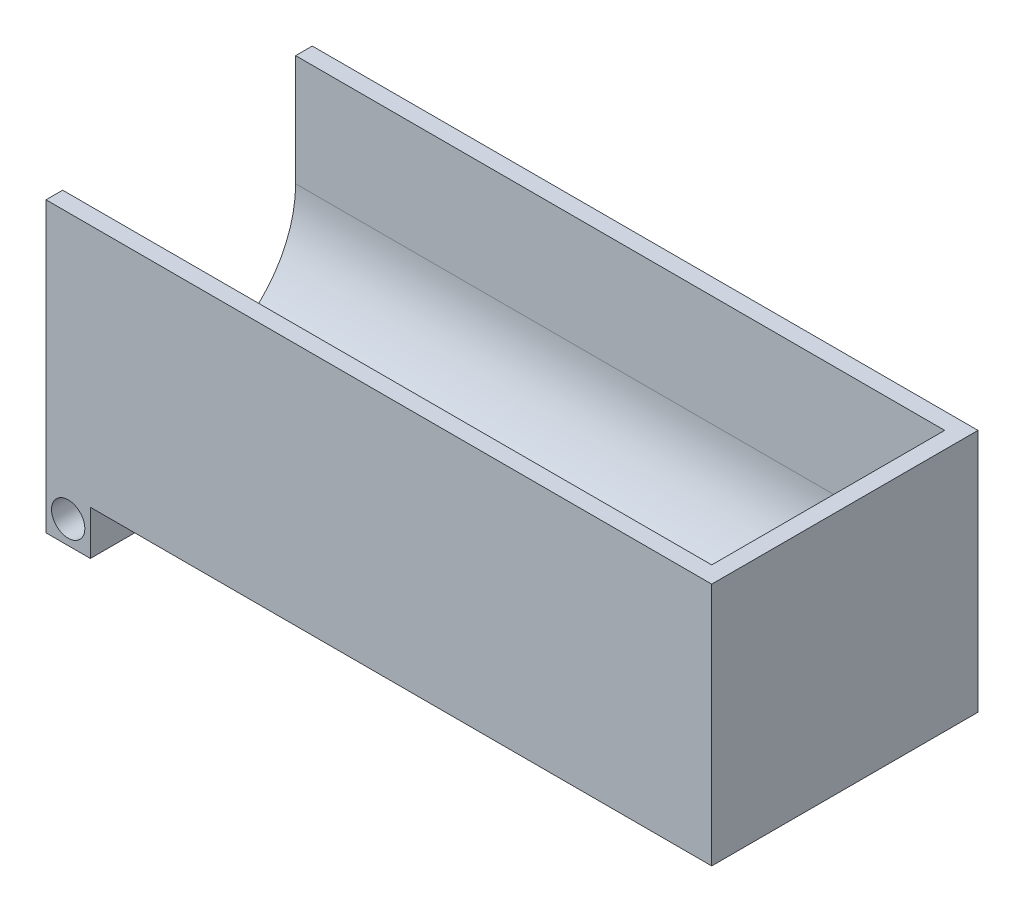
ISO-10303-21;
HEADER;
FILE_DESCRIPTION(('STEP AP214'),'2;1');
FILE_NAME('part.step','',(''),(''),'','','');
FILE_SCHEMA(('AUTOMOTIVE_DESIGN { 1 0 10303 214 1 1 1 1 }'));
ENDSEC;
DATA;
#1=APPLICATION_CONTEXT('core data for automotive mechanical design processes');
#2=APPLICATION_PROTOCOL_DEFINITION('international standard','automotive_design',2000,#1);
#3=PRODUCT_CONTEXT('',#1,'mechanical');
#4=PRODUCT('Part','Part','',(#3));
#5=PRODUCT_RELATED_PRODUCT_CATEGORY('part','',(#4));
#6=PRODUCT_DEFINITION_FORMATION('','',#4);
#7=PRODUCT_DEFINITION_CONTEXT('part definition',#1,'design');
#8=PRODUCT_DEFINITION('design','',#6,#7);
#9=PRODUCT_DEFINITION_SHAPE('','',#8);
#10=(LENGTH_UNIT() NAMED_UNIT(*) SI_UNIT(.MILLI.,.METRE.));
#11=(NAMED_UNIT(*) PLANE_ANGLE_UNIT() SI_UNIT($,.RADIAN.));
#12=(NAMED_UNIT(*) SI_UNIT($,.STERADIAN.) SOLID_ANGLE_UNIT());
#13=UNCERTAINTY_MEASURE_WITH_UNIT(LENGTH_MEASURE(1.E-05),#10,'distance_accuracy_value','');
#14=(GEOMETRIC_REPRESENTATION_CONTEXT(3) GLOBAL_UNCERTAINTY_ASSIGNED_CONTEXT((#13)) GLOBAL_UNIT_ASSIGNED_CONTEXT((#10,
#11,#12)) REPRESENTATION_CONTEXT('',''));
#15=CARTESIAN_POINT('',(0.,0.,0.));
#16=DIRECTION('',(0.,0.,1.));
#17=DIRECTION('',(1.,0.,0.));
#18=AXIS2_PLACEMENT_3D('',#15,#16,#17);
#19=CARTESIAN_POINT('',(120.,-24.,-24.));
#20=DIRECTION('',(0.,1.,0.));
#21=DIRECTION('',(0.,0.,1.));
#22=AXIS2_PLACEMENT_3D('',#19,#20,#21);
#23=PLANE('',#22);
#24=DIRECTION('',(-1.,0.,0.));
#25=VECTOR('',#24,1.);
#26=CARTESIAN_POINT('',(120.,-24.,24.));
#27=LINE('',#26,#25);
#28=CARTESIAN_POINT('',(120.,-24.,24.));
#29=VERTEX_POINT('',#28);
#30=CARTESIAN_POINT('',(8.,-24.,24.));
#31=VERTEX_POINT('',#30);
#32=EDGE_CURVE('E259',#29,#31,#27,.T.);
#33=ORIENTED_EDGE('',*,*,#32,.T.);
#34=DIRECTION('',(0.,0.,1.));
#35=VECTOR('',#34,1.);
#36=CARTESIAN_POINT('',(8.,-24.,-24.));
#37=LINE('',#36,#35);
#38=CARTESIAN_POINT('',(8.00000000000001,-24.,-24.));
#39=VERTEX_POINT('',#38);
#40=EDGE_CURVE('E239',#39,#31,#37,.T.);
#41=ORIENTED_EDGE('',*,*,#40,.F.);
#42=DIRECTION('',(-1.,0.,0.));
#43=VECTOR('',#42,1.);
#44=CARTESIAN_POINT('',(120.,-24.,-24.));
#45=LINE('',#44,#43);
#46=CARTESIAN_POINT('',(120.,-24.,-24.));
#47=VERTEX_POINT('',#46);
#48=EDGE_CURVE('E260',#47,#39,#45,.T.);
#49=ORIENTED_EDGE('',*,*,#48,.F.);
#50=DIRECTION('',(0.,0.,-1.));
#51=VECTOR('',#50,1.);
#52=CARTESIAN_POINT('',(120.,-24.,-24.));
#53=LINE('',#52,#51);
#54=EDGE_CURVE('E145',#29,#47,#53,.T.);
#55=ORIENTED_EDGE('',*,*,#54,.F.);
#56=EDGE_LOOP('',(#33,#41,#49,#55));
#57=FACE_BOUND('',#56,.T.);
#58=DIRECTION('',(0.,0.,-1.));
#59=VECTOR('',#58,1.);
#60=CARTESIAN_POINT('',(15.3705411386511,-24.,-13.3));
#61=LINE('',#60,#59);
#62=CARTESIAN_POINT('',(15.3705411386511,-24.,-10.3));
#63=VERTEX_POINT('',#62);
#64=CARTESIAN_POINT('',(15.3705411386511,-24.,-13.3));
#65=VERTEX_POINT('',#64);
#66=EDGE_CURVE('E195',#63,#65,#61,.T.);
#67=ORIENTED_EDGE('',*,*,#66,.F.);
#68=DIRECTION('',(-1.,0.,0.));
#69=VECTOR('',#68,1.);
#70=CARTESIAN_POINT('',(15.3705411386511,-24.,-10.3));
#71=LINE('',#70,#69);
#72=CARTESIAN_POINT('',(19.6916194956884,-24.,-10.3));
#73=VERTEX_POINT('',#72);
#74=EDGE_CURVE('E197',#73,#63,#71,.T.);
#75=ORIENTED_EDGE('',*,*,#74,.F.);
#76=DIRECTION('',(0.,0.,1.));
#77=VECTOR('',#76,1.);
#78=CARTESIAN_POINT('',(19.6916194956884,-24.,-13.3));
#79=LINE('',#78,#77);
#80=CARTESIAN_POINT('',(19.6916194956884,-24.,-13.3));
#81=VERTEX_POINT('',#80);
#82=EDGE_CURVE('E56',#81,#73,#79,.T.);
#83=ORIENTED_EDGE('',*,*,#82,.F.);
#84=DIRECTION('',(1.,0.,0.));
#85=VECTOR('',#84,1.);
#86=CARTESIAN_POINT('',(15.3705411386511,-24.,-13.3));
#87=LINE('',#86,#85);
#88=EDGE_CURVE('E53',#65,#81,#87,.T.);
#89=ORIENTED_EDGE('',*,*,#88,.F.);
#90=EDGE_LOOP('',(#67,#75,#83,#89));
#91=FACE_BOUND('',#90,.T.);
#92=ADVANCED_FACE('F39',(#57,#91),#23,.F.);
#93=CARTESIAN_POINT('',(120.,0.,0.));
#94=DIRECTION('',(-1.,0.,0.));
#95=DIRECTION('',(0.,0.,1.));
#96=AXIS2_PLACEMENT_3D('',#93,#94,#95);
#97=CYLINDRICAL_SURFACE('',#96,21.);
#98=DIRECTION('',(-1.,0.,0.));
#99=VECTOR('',#98,1.);
#100=CARTESIAN_POINT('',(120.,0.,21.));
#101=LINE('',#100,#99);
#102=CARTESIAN_POINT('',(117.,0.,21.));
#103=VERTEX_POINT('',#102);
#104=CARTESIAN_POINT('',(0.,0.,21.));
#105=VERTEX_POINT('',#104);
#106=EDGE_CURVE('E50',#103,#105,#101,.T.);
#107=ORIENTED_EDGE('',*,*,#106,.F.);
#108=CARTESIAN_POINT('',(117.,0.,0.));
#109=DIRECTION('',(-1.,0.,0.));
#110=DIRECTION('',(0.,0.,1.));
#111=AXIS2_PLACEMENT_3D('',#108,#109,#110);
#112=CIRCLE('',#111,21.);
#113=CARTESIAN_POINT('',(117.,0.,-21.));
#114=VERTEX_POINT('',#113);
#115=EDGE_CURVE('E11',#103,#114,#112,.F.);
#116=ORIENTED_EDGE('',*,*,#115,.T.);
#117=DIRECTION('',(-1.,0.,0.));
#118=VECTOR('',#117,1.);
#119=CARTESIAN_POINT('',(120.,0.,-21.));
#120=LINE('',#119,#118);
#121=CARTESIAN_POINT('',(0.,0.,-21.));
#122=VERTEX_POINT('',#121);
#123=EDGE_CURVE('E150',#114,#122,#120,.T.);
#124=ORIENTED_EDGE('',*,*,#123,.T.);
#125=CARTESIAN_POINT('',(0.,0.,0.));
#126=DIRECTION('',(-1.,0.,0.));
#127=DIRECTION('',(0.,0.,1.));
#128=AXIS2_PLACEMENT_3D('',#125,#126,#127);
#129=CIRCLE('',#128,21.);
#130=EDGE_CURVE('E245',#122,#105,#129,.T.);
#131=ORIENTED_EDGE('',*,*,#130,.T.);
#132=EDGE_LOOP('',(#107,#116,#124,#131));
#133=FACE_BOUND('',#132,.T.);
#134=ADVANCED_FACE('F41',(#133),#97,.F.);
#135=CARTESIAN_POINT('',(120.,-24.,24.));
#136=DIRECTION('',(0.,0.,-1.));
#137=DIRECTION('',(0.,1.,0.));
#138=AXIS2_PLACEMENT_3D('',#135,#136,#137);
#139=PLANE('',#138);
#140=DIRECTION('',(0.,-1.,0.));
#141=VECTOR('',#140,1.);
#142=CARTESIAN_POINT('',(120.,-24.,24.));
#143=LINE('',#142,#141);
#144=CARTESIAN_POINT('',(120.,20.,24.));
#145=VERTEX_POINT('',#144);
#146=EDGE_CURVE('E250',#145,#29,#143,.T.);
#147=ORIENTED_EDGE('',*,*,#146,.F.);
#148=DIRECTION('',(1.,0.,0.));
#149=VECTOR('',#148,1.);
#150=CARTESIAN_POINT('',(0.,20.,24.));
#151=LINE('',#150,#149);
#152=CARTESIAN_POINT('',(0.,20.,24.));
#153=VERTEX_POINT('',#152);
#154=EDGE_CURVE('E162',#153,#145,#151,.T.);
#155=ORIENTED_EDGE('',*,*,#154,.F.);
#156=DIRECTION('',(0.,-1.,0.));
#157=VECTOR('',#156,1.);
#158=CARTESIAN_POINT('',(0.,-24.,24.));
#159=LINE('',#158,#157);
#160=CARTESIAN_POINT('',(0.,-32.,24.));
#161=VERTEX_POINT('',#160);
#162=EDGE_CURVE('E252',#153,#161,#159,.T.);
#163=ORIENTED_EDGE('',*,*,#162,.T.);
#164=DIRECTION('',(1.,0.,0.));
#165=VECTOR('',#164,1.);
#166=CARTESIAN_POINT('',(0.,-32.,24.));
#167=LINE('',#166,#165);
#168=CARTESIAN_POINT('',(8.,-32.,24.));
#169=VERTEX_POINT('',#168);
#170=EDGE_CURVE('E226',#161,#169,#167,.T.);
#171=ORIENTED_EDGE('',*,*,#170,.T.);
#172=DIRECTION('',(0.,1.,0.));
#173=VECTOR('',#172,1.);
#174=CARTESIAN_POINT('',(8.,-24.,24.));
#175=LINE('',#174,#173);
#176=EDGE_CURVE('E233',#169,#31,#175,.T.);
#177=ORIENTED_EDGE('',*,*,#176,.T.);
#178=ORIENTED_EDGE('',*,*,#32,.F.);
#179=EDGE_LOOP('',(#147,#155,#163,#171,#177,#178));
#180=FACE_BOUND('',#179,.T.);
#181=CARTESIAN_POINT('',(4.,-27.8358408085531,24.));
#182=DIRECTION('',(0.,0.,1.));
#183=DIRECTION('',(1.,0.,0.));
#184=AXIS2_PLACEMENT_3D('',#181,#182,#183);
#185=CIRCLE('',#184,3.);
#186=CARTESIAN_POINT('',(7.,-27.8358408085531,24.));
#187=VERTEX_POINT('',#186);
#188=EDGE_CURVE('E219',#187,#187,#185,.T.);
#189=ORIENTED_EDGE('',*,*,#188,.F.);
#190=EDGE_LOOP('',(#189));
#191=FACE_BOUND('',#190,.T.);
#192=ADVANCED_FACE('F292',(#180,#191),#139,.F.);
#193=CARTESIAN_POINT('',(120.,0.,-24.));
#194=DIRECTION('',(0.,0.,1.));
#195=DIRECTION('',(0.,-1.,0.));
#196=AXIS2_PLACEMENT_3D('',#193,#194,#195);
#197=PLANE('',#196);
#198=ORIENTED_EDGE('',*,*,#48,.T.);
#199=DIRECTION('',(0.,1.,0.));
#200=VECTOR('',#199,1.);
#201=CARTESIAN_POINT('',(8.,-24.,-24.));
#202=LINE('',#201,#200);
#203=CARTESIAN_POINT('',(8.,-32.,-24.));
#204=VERTEX_POINT('',#203);
#205=EDGE_CURVE('E229',#204,#39,#202,.T.);
#206=ORIENTED_EDGE('',*,*,#205,.F.);
#207=DIRECTION('',(1.,0.,0.));
#208=VECTOR('',#207,1.);
#209=CARTESIAN_POINT('',(0.,-32.,-24.));
#210=LINE('',#209,#208);
#211=CARTESIAN_POINT('',(0.,-32.,-24.));
#212=VERTEX_POINT('',#211);
#213=EDGE_CURVE('E230',#212,#204,#210,.T.);
#214=ORIENTED_EDGE('',*,*,#213,.F.);
#215=DIRECTION('',(0.,1.,0.));
#216=VECTOR('',#215,1.);
#217=CARTESIAN_POINT('',(0.,0.,-24.));
#218=LINE('',#217,#216);
#219=CARTESIAN_POINT('',(0.,20.,-24.));
#220=VERTEX_POINT('',#219);
#221=EDGE_CURVE('E152',#212,#220,#218,.T.);
#222=ORIENTED_EDGE('',*,*,#221,.T.);
#223=DIRECTION('',(-1.,0.,0.));
#224=VECTOR('',#223,1.);
#225=CARTESIAN_POINT('',(120.,20.,-24.));
#226=LINE('',#225,#224);
#227=CARTESIAN_POINT('',(120.,20.,-24.));
#228=VERTEX_POINT('',#227);
#229=EDGE_CURVE('E147',#228,#220,#226,.T.);
#230=ORIENTED_EDGE('',*,*,#229,.F.);
#231=DIRECTION('',(0.,1.,0.));
#232=VECTOR('',#231,1.);
#233=CARTESIAN_POINT('',(120.,0.,-24.));
#234=LINE('',#233,#232);
#235=EDGE_CURVE('E136',#47,#228,#234,.T.);
#236=ORIENTED_EDGE('',*,*,#235,.F.);
#237=EDGE_LOOP('',(#198,#206,#214,#222,#230,#236));
#238=FACE_BOUND('',#237,.T.);
#239=CARTESIAN_POINT('',(4.,-27.8358408085531,-24.));
#240=DIRECTION('',(0.,0.,1.));
#241=DIRECTION('',(0.,-1.,0.));
#242=AXIS2_PLACEMENT_3D('',#239,#240,#241);
#243=CIRCLE('',#242,3.);
#244=CARTESIAN_POINT('',(4.,-30.8358408085531,-24.));
#245=VERTEX_POINT('',#244);
#246=EDGE_CURVE('E224',#245,#245,#243,.F.);
#247=ORIENTED_EDGE('',*,*,#246,.F.);
#248=EDGE_LOOP('',(#247));
#249=FACE_BOUND('',#248,.T.);
#250=ADVANCED_FACE('F151',(#238,#249),#197,.F.);
#251=CARTESIAN_POINT('',(120.,0.,0.));
#252=DIRECTION('',(-1.,0.,0.));
#253=DIRECTION('',(0.,0.,1.));
#254=AXIS2_PLACEMENT_3D('',#251,#252,#253);
#255=PLANE('',#254);
#256=ORIENTED_EDGE('',*,*,#235,.T.);
#257=DIRECTION('',(0.,0.,-1.));
#258=VECTOR('',#257,1.);
#259=CARTESIAN_POINT('',(120.,20.,24.));
#260=LINE('',#259,#258);
#261=EDGE_CURVE('E142',#145,#228,#260,.T.);
#262=ORIENTED_EDGE('',*,*,#261,.F.);
#263=ORIENTED_EDGE('',*,*,#146,.T.);
#264=ORIENTED_EDGE('',*,*,#54,.T.);
#265=EDGE_LOOP('',(#256,#262,#263,#264));
#266=FACE_BOUND('',#265,.T.);
#267=ADVANCED_FACE('F137',(#266),#255,.F.);
#268=CARTESIAN_POINT('',(0.,0.,0.));
#269=DIRECTION('',(-1.,0.,0.));
#270=DIRECTION('',(0.,0.,1.));
#271=AXIS2_PLACEMENT_3D('',#268,#269,#270);
#272=PLANE('',#271);
#273=ORIENTED_EDGE('',*,*,#130,.F.);
#274=DIRECTION('',(0.,-1.,0.));
#275=VECTOR('',#274,1.);
#276=CARTESIAN_POINT('',(0.,20.,-21.));
#277=LINE('',#276,#275);
#278=CARTESIAN_POINT('',(0.,20.,-21.));
#279=VERTEX_POINT('',#278);
#280=EDGE_CURVE('E184',#279,#122,#277,.T.);
#281=ORIENTED_EDGE('',*,*,#280,.F.);
#282=DIRECTION('',(0.,0.,1.));
#283=VECTOR('',#282,1.);
#284=CARTESIAN_POINT('',(0.,20.,-24.));
#285=LINE('',#284,#283);
#286=EDGE_CURVE('E160',#220,#279,#285,.T.);
#287=ORIENTED_EDGE('',*,*,#286,.F.);
#288=ORIENTED_EDGE('',*,*,#221,.F.);
#289=DIRECTION('',(0.,0.,1.));
#290=VECTOR('',#289,1.);
#291=CARTESIAN_POINT('',(0.,-32.,-24.));
#292=LINE('',#291,#290);
#293=EDGE_CURVE('E234',#212,#161,#292,.T.);
#294=ORIENTED_EDGE('',*,*,#293,.T.);
#295=ORIENTED_EDGE('',*,*,#162,.F.);
#296=DIRECTION('',(0.,0.,1.));
#297=VECTOR('',#296,1.);
#298=CARTESIAN_POINT('',(0.,20.,21.));
#299=LINE('',#298,#297);
#300=CARTESIAN_POINT('',(0.,20.,21.));
#301=VERTEX_POINT('',#300);
#302=EDGE_CURVE('E172',#301,#153,#299,.T.);
#303=ORIENTED_EDGE('',*,*,#302,.F.);
#304=DIRECTION('',(0.,-1.,0.));
#305=VECTOR('',#304,1.);
#306=CARTESIAN_POINT('',(0.,20.,21.));
#307=LINE('',#306,#305);
#308=EDGE_CURVE('E178',#301,#105,#307,.T.);
#309=ORIENTED_EDGE('',*,*,#308,.T.);
#310=EDGE_LOOP('',(#273,#281,#287,#288,#294,#295,#303,#309));
#311=FACE_BOUND('',#310,.T.);
#312=ADVANCED_FACE('F271',(#311),#272,.T.);
#313=CARTESIAN_POINT('',(8.,-24.,-24.));
#314=DIRECTION('',(1.,0.,0.));
#315=DIRECTION('',(0.,0.,-1.));
#316=AXIS2_PLACEMENT_3D('',#313,#314,#315);
#317=PLANE('',#316);
#318=ORIENTED_EDGE('',*,*,#176,.F.);
#319=DIRECTION('',(0.,0.,1.));
#320=VECTOR('',#319,1.);
#321=CARTESIAN_POINT('',(8.,-32.,-24.));
#322=LINE('',#321,#320);
#323=EDGE_CURVE('E242',#204,#169,#322,.T.);
#324=ORIENTED_EDGE('',*,*,#323,.F.);
#325=ORIENTED_EDGE('',*,*,#205,.T.);
#326=ORIENTED_EDGE('',*,*,#40,.T.);
#327=EDGE_LOOP('',(#318,#324,#325,#326));
#328=FACE_BOUND('',#327,.T.);
#329=ADVANCED_FACE('F286',(#328),#317,.T.);
#330=CARTESIAN_POINT('',(0.,-32.,-24.));
#331=DIRECTION('',(0.,-1.,0.));
#332=DIRECTION('',(0.,0.,-1.));
#333=AXIS2_PLACEMENT_3D('',#330,#331,#332);
#334=PLANE('',#333);
#335=ORIENTED_EDGE('',*,*,#170,.F.);
#336=ORIENTED_EDGE('',*,*,#293,.F.);
#337=ORIENTED_EDGE('',*,*,#213,.T.);
#338=ORIENTED_EDGE('',*,*,#323,.T.);
#339=EDGE_LOOP('',(#335,#336,#337,#338));
#340=FACE_BOUND('',#339,.T.);
#341=ADVANCED_FACE('F282',(#340),#334,.T.);
#342=CARTESIAN_POINT('',(4.,-27.8358408085531,-24.001));
#343=DIRECTION('',(0.,0.,1.));
#344=DIRECTION('',(1.,0.,0.));
#345=AXIS2_PLACEMENT_3D('',#342,#343,#344);
#346=CYLINDRICAL_SURFACE('',#345,3.);
#347=ORIENTED_EDGE('',*,*,#188,.T.);
#348=EDGE_LOOP('',(#347));
#349=FACE_BOUND('',#348,.T.);
#350=ORIENTED_EDGE('',*,*,#246,.T.);
#351=EDGE_LOOP('',(#350));
#352=FACE_BOUND('',#351,.T.);
#353=ADVANCED_FACE('F327',(#349,#352),#346,.F.);
#354=CARTESIAN_POINT('',(117.,0.,0.));
#355=DIRECTION('',(-1.,0.,0.));
#356=DIRECTION('',(0.,0.,1.));
#357=AXIS2_PLACEMENT_3D('',#354,#355,#356);
#358=PLANE('',#357);
#359=ORIENTED_EDGE('',*,*,#115,.F.);
#360=DIRECTION('',(0.,-1.,0.));
#361=VECTOR('',#360,1.);
#362=CARTESIAN_POINT('',(117.,20.,21.));
#363=LINE('',#362,#361);
#364=CARTESIAN_POINT('',(117.,20.,21.));
#365=VERTEX_POINT('',#364);
#366=EDGE_CURVE('E179',#365,#103,#363,.T.);
#367=ORIENTED_EDGE('',*,*,#366,.F.);
#368=DIRECTION('',(0.,0.,1.));
#369=VECTOR('',#368,1.);
#370=CARTESIAN_POINT('',(117.,20.,-21.));
#371=LINE('',#370,#369);
#372=CARTESIAN_POINT('',(117.,20.,-21.));
#373=VERTEX_POINT('',#372);
#374=EDGE_CURVE('E166',#373,#365,#371,.T.);
#375=ORIENTED_EDGE('',*,*,#374,.F.);
#376=DIRECTION('',(0.,-1.,0.));
#377=VECTOR('',#376,1.);
#378=CARTESIAN_POINT('',(117.,20.,-21.));
#379=LINE('',#378,#377);
#380=EDGE_CURVE('E182',#373,#114,#379,.T.);
#381=ORIENTED_EDGE('',*,*,#380,.T.);
#382=EDGE_LOOP('',(#359,#367,#375,#381));
#383=FACE_BOUND('',#382,.T.);
#384=ADVANCED_FACE('F276',(#383),#358,.T.);
#385=CARTESIAN_POINT('',(15.3705411386511,-29.,-13.3));
#386=DIRECTION('',(1.,0.,0.));
#387=DIRECTION('',(0.,0.,-1.));
#388=AXIS2_PLACEMENT_3D('',#385,#386,#387);
#389=PLANE('',#388);
#390=ORIENTED_EDGE('',*,*,#66,.T.);
#391=DIRECTION('',(0.,1.,0.));
#392=VECTOR('',#391,1.);
#393=CARTESIAN_POINT('',(15.3705411386511,-29.,-13.3));
#394=LINE('',#393,#392);
#395=CARTESIAN_POINT('',(15.3705411386511,-29.,-13.3));
#396=VERTEX_POINT('',#395);
#397=EDGE_CURVE('E217',#396,#65,#394,.T.);
#398=ORIENTED_EDGE('',*,*,#397,.F.);
#399=DIRECTION('',(0.,0.,-1.));
#400=VECTOR('',#399,1.);
#401=CARTESIAN_POINT('',(15.3705411386511,-29.,-13.3));
#402=LINE('',#401,#400);
#403=CARTESIAN_POINT('',(15.3705411386511,-29.,-10.3));
#404=VERTEX_POINT('',#403);
#405=EDGE_CURVE('E191',#404,#396,#402,.T.);
#406=ORIENTED_EDGE('',*,*,#405,.F.);
#407=DIRECTION('',(0.,1.,0.));
#408=VECTOR('',#407,1.);
#409=CARTESIAN_POINT('',(15.3705411386511,-29.,-10.3));
#410=LINE('',#409,#408);
#411=EDGE_CURVE('E201',#404,#63,#410,.T.);
#412=ORIENTED_EDGE('',*,*,#411,.T.);
#413=EDGE_LOOP('',(#390,#398,#406,#412));
#414=FACE_BOUND('',#413,.T.);
#415=ADVANCED_FACE('F304',(#414),#389,.F.);
#416=CARTESIAN_POINT('',(15.3705411386511,-29.,-13.3));
#417=DIRECTION('',(0.,0.,1.));
#418=DIRECTION('',(0.,-1.,0.));
#419=AXIS2_PLACEMENT_3D('',#416,#417,#418);
#420=PLANE('',#419);
#421=CARTESIAN_POINT('',(17.5310803171698,-26.5,-13.3));
#422=DIRECTION('',(0.,0.,1.));
#423=DIRECTION('',(0.,-1.,0.));
#424=AXIS2_PLACEMENT_3D('',#421,#422,#423);
#425=CIRCLE('',#424,0.750000000000002);
#426=CARTESIAN_POINT('',(17.5310803171698,-27.25,-13.3));
#427=VERTEX_POINT('',#426);
#428=EDGE_CURVE('E188',#427,#427,#425,.T.);
#429=ORIENTED_EDGE('',*,*,#428,.T.);
#430=EDGE_LOOP('',(#429));
#431=FACE_BOUND('',#430,.T.);
#432=ORIENTED_EDGE('',*,*,#88,.T.);
#433=DIRECTION('',(0.,1.,0.));
#434=VECTOR('',#433,1.);
#435=CARTESIAN_POINT('',(19.6916194956884,-29.,-13.3));
#436=LINE('',#435,#434);
#437=CARTESIAN_POINT('',(19.6916194956884,-29.,-13.3));
#438=VERTEX_POINT('',#437);
#439=EDGE_CURVE('E214',#438,#81,#436,.T.);
#440=ORIENTED_EDGE('',*,*,#439,.F.);
#441=DIRECTION('',(1.,0.,0.));
#442=VECTOR('',#441,1.);
#443=CARTESIAN_POINT('',(15.3705411386511,-29.,-13.3));
#444=LINE('',#443,#442);
#445=EDGE_CURVE('E198',#396,#438,#444,.T.);
#446=ORIENTED_EDGE('',*,*,#445,.F.);
#447=ORIENTED_EDGE('',*,*,#397,.T.);
#448=EDGE_LOOP('',(#432,#440,#446,#447));
#449=FACE_BOUND('',#448,.T.);
#450=ADVANCED_FACE('F315',(#431,#449),#420,.F.);
#451=CARTESIAN_POINT('',(19.6916194956884,-29.,-13.3));
#452=DIRECTION('',(-1.,0.,0.));
#453=DIRECTION('',(0.,0.,1.));
#454=AXIS2_PLACEMENT_3D('',#451,#452,#453);
#455=PLANE('',#454);
#456=ORIENTED_EDGE('',*,*,#82,.T.);
#457=DIRECTION('',(0.,1.,0.));
#458=VECTOR('',#457,1.);
#459=CARTESIAN_POINT('',(19.6916194956884,-29.,-10.3));
#460=LINE('',#459,#458);
#461=CARTESIAN_POINT('',(19.6916194956884,-29.,-10.3));
#462=VERTEX_POINT('',#461);
#463=EDGE_CURVE('E215',#462,#73,#460,.T.);
#464=ORIENTED_EDGE('',*,*,#463,.F.);
#465=DIRECTION('',(0.,0.,1.));
#466=VECTOR('',#465,1.);
#467=CARTESIAN_POINT('',(19.6916194956884,-29.,-13.3));
#468=LINE('',#467,#466);
#469=EDGE_CURVE('E200',#438,#462,#468,.T.);
#470=ORIENTED_EDGE('',*,*,#469,.F.);
#471=ORIENTED_EDGE('',*,*,#439,.T.);
#472=EDGE_LOOP('',(#456,#464,#470,#471));
#473=FACE_BOUND('',#472,.T.);
#474=ADVANCED_FACE('F309',(#473),#455,.F.);
#475=CARTESIAN_POINT('',(15.3705411386511,-29.,-10.3));
#476=DIRECTION('',(0.,0.,-1.));
#477=DIRECTION('',(0.,1.,0.));
#478=AXIS2_PLACEMENT_3D('',#475,#476,#477);
#479=PLANE('',#478);
#480=CARTESIAN_POINT('',(17.5310803171698,-26.5,-10.3));
#481=DIRECTION('',(0.,0.,1.));
#482=DIRECTION('',(1.,0.,0.));
#483=AXIS2_PLACEMENT_3D('',#480,#481,#482);
#484=CIRCLE('',#483,0.750000000000002);
#485=CARTESIAN_POINT('',(18.2810803171698,-26.5,-10.3));
#486=VERTEX_POINT('',#485);
#487=EDGE_CURVE('E186',#486,#486,#484,.T.);
#488=ORIENTED_EDGE('',*,*,#487,.F.);
#489=EDGE_LOOP('',(#488));
#490=FACE_BOUND('',#489,.T.);
#491=ORIENTED_EDGE('',*,*,#74,.T.);
#492=ORIENTED_EDGE('',*,*,#411,.F.);
#493=DIRECTION('',(-1.,0.,0.));
#494=VECTOR('',#493,1.);
#495=CARTESIAN_POINT('',(15.3705411386511,-29.,-10.3));
#496=LINE('',#495,#494);
#497=EDGE_CURVE('E203',#462,#404,#496,.T.);
#498=ORIENTED_EDGE('',*,*,#497,.F.);
#499=ORIENTED_EDGE('',*,*,#463,.T.);
#500=EDGE_LOOP('',(#491,#492,#498,#499));
#501=FACE_BOUND('',#500,.T.);
#502=ADVANCED_FACE('F299',(#490,#501),#479,.F.);
#503=CARTESIAN_POINT('',(0.,-29.,0.));
#504=DIRECTION('',(0.,1.,0.));
#505=DIRECTION('',(0.,0.,1.));
#506=AXIS2_PLACEMENT_3D('',#503,#504,#505);
#507=PLANE('',#506);
#508=ORIENTED_EDGE('',*,*,#405,.T.);
#509=ORIENTED_EDGE('',*,*,#445,.T.);
#510=ORIENTED_EDGE('',*,*,#469,.T.);
#511=ORIENTED_EDGE('',*,*,#497,.T.);
#512=EDGE_LOOP('',(#508,#509,#510,#511));
#513=FACE_BOUND('',#512,.T.);
#514=ADVANCED_FACE('F308',(#513),#507,.F.);
#515=CARTESIAN_POINT('',(17.5310803171698,-26.5,-24.));
#516=DIRECTION('',(0.,0.,1.));
#517=DIRECTION('',(1.,0.,0.));
#518=AXIS2_PLACEMENT_3D('',#515,#516,#517);
#519=CYLINDRICAL_SURFACE('',#518,0.750000000000002);
#520=ORIENTED_EDGE('',*,*,#487,.T.);
#521=EDGE_LOOP('',(#520));
#522=FACE_BOUND('',#521,.T.);
#523=ORIENTED_EDGE('',*,*,#428,.F.);
#524=EDGE_LOOP('',(#523));
#525=FACE_BOUND('',#524,.T.);
#526=ADVANCED_FACE('F355',(#522,#525),#519,.F.);
#527=CARTESIAN_POINT('',(0.,20.,-21.));
#528=DIRECTION('',(0.,0.,-1.));
#529=DIRECTION('',(-1.,0.,0.));
#530=AXIS2_PLACEMENT_3D('',#527,#528,#529);
#531=PLANE('',#530);
#532=ORIENTED_EDGE('',*,*,#123,.F.);
#533=ORIENTED_EDGE('',*,*,#380,.F.);
#534=DIRECTION('',(1.,0.,0.));
#535=VECTOR('',#534,1.);
#536=CARTESIAN_POINT('',(0.,20.,-21.));
#537=LINE('',#536,#535);
#538=EDGE_CURVE('E170',#279,#373,#537,.T.);
#539=ORIENTED_EDGE('',*,*,#538,.F.);
#540=ORIENTED_EDGE('',*,*,#280,.T.);
#541=EDGE_LOOP('',(#532,#533,#539,#540));
#542=FACE_BOUND('',#541,.T.);
#543=ADVANCED_FACE('F274',(#542),#531,.F.);
#544=CARTESIAN_POINT('',(117.,20.,21.));
#545=DIRECTION('',(0.,0.,1.));
#546=DIRECTION('',(1.,0.,0.));
#547=AXIS2_PLACEMENT_3D('',#544,#545,#546);
#548=PLANE('',#547);
#549=ORIENTED_EDGE('',*,*,#106,.T.);
#550=ORIENTED_EDGE('',*,*,#308,.F.);
#551=DIRECTION('',(-1.,0.,0.));
#552=VECTOR('',#551,1.);
#553=CARTESIAN_POINT('',(117.,20.,21.));
#554=LINE('',#553,#552);
#555=EDGE_CURVE('E171',#365,#301,#554,.T.);
#556=ORIENTED_EDGE('',*,*,#555,.F.);
#557=ORIENTED_EDGE('',*,*,#366,.T.);
#558=EDGE_LOOP('',(#549,#550,#556,#557));
#559=FACE_BOUND('',#558,.T.);
#560=ADVANCED_FACE('F263',(#559),#548,.F.);
#561=CARTESIAN_POINT('',(0.,20.,0.));
#562=DIRECTION('',(0.,1.,0.));
#563=DIRECTION('',(0.,0.,1.));
#564=AXIS2_PLACEMENT_3D('',#561,#562,#563);
#565=PLANE('',#564);
#566=ORIENTED_EDGE('',*,*,#261,.T.);
#567=ORIENTED_EDGE('',*,*,#229,.T.);
#568=ORIENTED_EDGE('',*,*,#286,.T.);
#569=ORIENTED_EDGE('',*,*,#538,.T.);
#570=ORIENTED_EDGE('',*,*,#374,.T.);
#571=ORIENTED_EDGE('',*,*,#555,.T.);
#572=ORIENTED_EDGE('',*,*,#302,.T.);
#573=ORIENTED_EDGE('',*,*,#154,.T.);
#574=EDGE_LOOP('',(#566,#567,#568,#569,#570,#571,#572,#573));
#575=FACE_BOUND('',#574,.T.);
#576=ADVANCED_FACE('F159',(#575),#565,.T.);
#577=CLOSED_SHELL('',(#92,#134,#192,#250,#267,#312,#329,#341,#353,#384,#415,#450,#474,#502,#514,
#526,#543,#560,#576));
#578=MANIFOLD_SOLID_BREP('B2',#577);
#579=ADVANCED_BREP_SHAPE_REPRESENTATION('',(#18,#578),#14);
#580=SHAPE_DEFINITION_REPRESENTATION(#9,#579);
ENDSEC;
END-ISO-10303-21;
